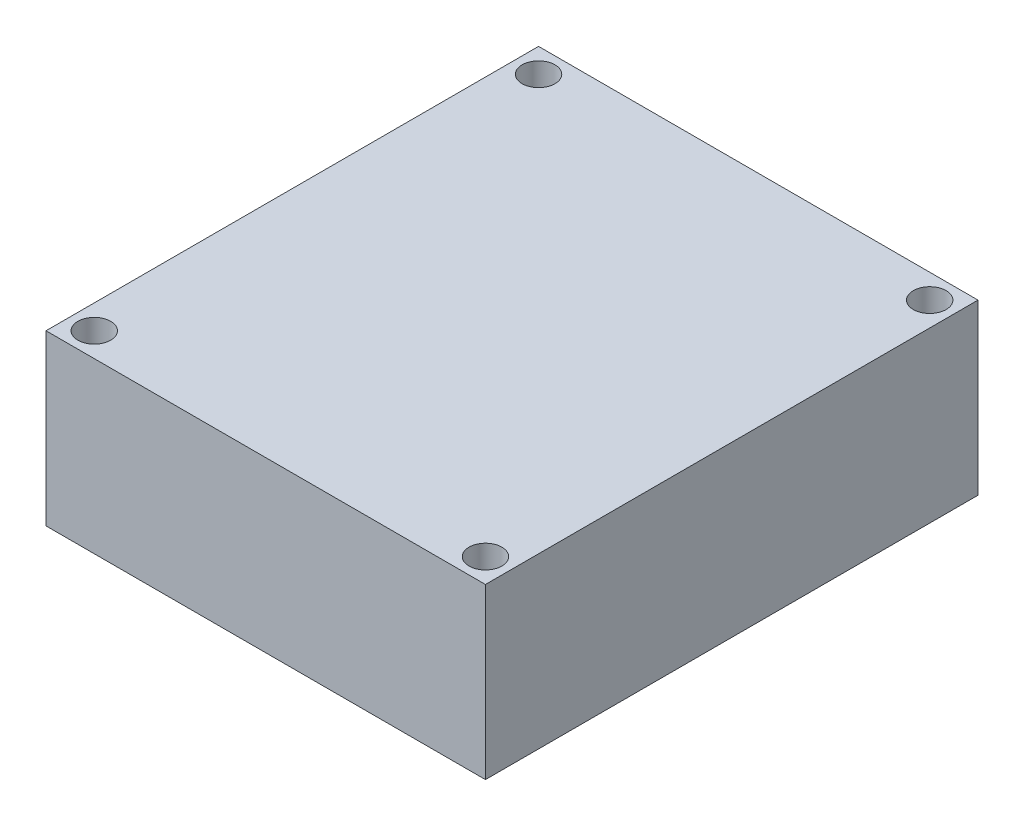
ISO-10303-21;
HEADER;
FILE_DESCRIPTION(('STEP AP214'),'2;1');
FILE_NAME('part.step','',(''),(''),'','','');
FILE_SCHEMA(('AUTOMOTIVE_DESIGN { 1 0 10303 214 1 1 1 1 }'));
ENDSEC;
DATA;
#1=APPLICATION_CONTEXT('core data for automotive mechanical design processes');
#2=APPLICATION_PROTOCOL_DEFINITION('international standard','automotive_design',2000,#1);
#3=PRODUCT_CONTEXT('',#1,'mechanical');
#4=PRODUCT('Part','Part','',(#3));
#5=PRODUCT_RELATED_PRODUCT_CATEGORY('part','',(#4));
#6=PRODUCT_DEFINITION_FORMATION('','',#4);
#7=PRODUCT_DEFINITION_CONTEXT('part definition',#1,'design');
#8=PRODUCT_DEFINITION('design','',#6,#7);
#9=PRODUCT_DEFINITION_SHAPE('','',#8);
#10=(LENGTH_UNIT() NAMED_UNIT(*) SI_UNIT(.MILLI.,.METRE.));
#11=(NAMED_UNIT(*) PLANE_ANGLE_UNIT() SI_UNIT($,.RADIAN.));
#12=(NAMED_UNIT(*) SI_UNIT($,.STERADIAN.) SOLID_ANGLE_UNIT());
#13=UNCERTAINTY_MEASURE_WITH_UNIT(LENGTH_MEASURE(1.E-05),#10,'distance_accuracy_value','');
#14=(GEOMETRIC_REPRESENTATION_CONTEXT(3) GLOBAL_UNCERTAINTY_ASSIGNED_CONTEXT((#13)) GLOBAL_UNIT_ASSIGNED_CONTEXT((#10,
#11,#12)) REPRESENTATION_CONTEXT('',''));
#15=CARTESIAN_POINT('',(0.,0.,0.));
#16=DIRECTION('',(0.,0.,1.));
#17=DIRECTION('',(1.,0.,0.));
#18=AXIS2_PLACEMENT_3D('',#15,#16,#17);
#19=CARTESIAN_POINT('',(-22.75,17.5,25.5));
#20=DIRECTION('',(1.,0.,0.));
#21=DIRECTION('',(0.,0.,-1.));
#22=AXIS2_PLACEMENT_3D('',#19,#20,#21);
#23=PLANE('',#22);
#24=DIRECTION('',(0.,0.,1.));
#25=VECTOR('',#24,1.);
#26=CARTESIAN_POINT('',(-22.75,0.,25.5));
#27=LINE('',#26,#25);
#28=CARTESIAN_POINT('',(-22.75,0.,-25.5));
#29=VERTEX_POINT('',#28);
#30=CARTESIAN_POINT('',(-22.75,0.,25.5));
#31=VERTEX_POINT('',#30);
#32=EDGE_CURVE('E98',#29,#31,#27,.T.);
#33=ORIENTED_EDGE('',*,*,#32,.T.);
#34=DIRECTION('',(0.,-1.,0.));
#35=VECTOR('',#34,1.);
#36=CARTESIAN_POINT('',(-22.75,17.5,25.5));
#37=LINE('',#36,#35);
#38=CARTESIAN_POINT('',(-22.75,17.5,25.5));
#39=VERTEX_POINT('',#38);
#40=EDGE_CURVE('E11',#39,#31,#37,.T.);
#41=ORIENTED_EDGE('',*,*,#40,.F.);
#42=DIRECTION('',(0.,0.,1.));
#43=VECTOR('',#42,1.);
#44=CARTESIAN_POINT('',(-22.75,17.5,25.5));
#45=LINE('',#44,#43);
#46=CARTESIAN_POINT('',(-22.75,17.5,-25.5));
#47=VERTEX_POINT('',#46);
#48=EDGE_CURVE('E86',#47,#39,#45,.T.);
#49=ORIENTED_EDGE('',*,*,#48,.F.);
#50=DIRECTION('',(0.,-1.,0.));
#51=VECTOR('',#50,1.);
#52=CARTESIAN_POINT('',(-22.75,17.5,-25.5));
#53=LINE('',#52,#51);
#54=EDGE_CURVE('E94',#47,#29,#53,.T.);
#55=ORIENTED_EDGE('',*,*,#54,.T.);
#56=EDGE_LOOP('',(#33,#41,#49,#55));
#57=FACE_BOUND('',#56,.T.);
#58=ADVANCED_FACE('F35',(#57),#23,.F.);
#59=CARTESIAN_POINT('',(22.75,17.5,25.5));
#60=DIRECTION('',(0.,0.,-1.));
#61=DIRECTION('',(-1.,0.,0.));
#62=AXIS2_PLACEMENT_3D('',#59,#60,#61);
#63=PLANE('',#62);
#64=DIRECTION('',(1.,0.,0.));
#65=VECTOR('',#64,1.);
#66=CARTESIAN_POINT('',(22.75,0.,25.5));
#67=LINE('',#66,#65);
#68=CARTESIAN_POINT('',(22.75,0.,25.5));
#69=VERTEX_POINT('',#68);
#70=EDGE_CURVE('E90',#31,#69,#67,.T.);
#71=ORIENTED_EDGE('',*,*,#70,.T.);
#72=DIRECTION('',(0.,-1.,0.));
#73=VECTOR('',#72,1.);
#74=CARTESIAN_POINT('',(22.75,17.5,25.5));
#75=LINE('',#74,#73);
#76=CARTESIAN_POINT('',(22.75,17.5,25.5));
#77=VERTEX_POINT('',#76);
#78=EDGE_CURVE('E43',#77,#69,#75,.T.);
#79=ORIENTED_EDGE('',*,*,#78,.F.);
#80=DIRECTION('',(1.,0.,0.));
#81=VECTOR('',#80,1.);
#82=CARTESIAN_POINT('',(22.75,17.5,25.5));
#83=LINE('',#82,#81);
#84=EDGE_CURVE('E81',#39,#77,#83,.T.);
#85=ORIENTED_EDGE('',*,*,#84,.F.);
#86=ORIENTED_EDGE('',*,*,#40,.T.);
#87=EDGE_LOOP('',(#71,#79,#85,#86));
#88=FACE_BOUND('',#87,.T.);
#89=ADVANCED_FACE('F89',(#88),#63,.F.);
#90=CARTESIAN_POINT('',(22.75,17.5,25.5));
#91=DIRECTION('',(-1.,0.,0.));
#92=DIRECTION('',(0.,0.,1.));
#93=AXIS2_PLACEMENT_3D('',#90,#91,#92);
#94=PLANE('',#93);
#95=DIRECTION('',(0.,0.,-1.));
#96=VECTOR('',#95,1.);
#97=CARTESIAN_POINT('',(22.75,0.,25.5));
#98=LINE('',#97,#96);
#99=CARTESIAN_POINT('',(22.75,0.,-25.5));
#100=VERTEX_POINT('',#99);
#101=EDGE_CURVE('E68',#69,#100,#98,.T.);
#102=ORIENTED_EDGE('',*,*,#101,.T.);
#103=DIRECTION('',(0.,-1.,0.));
#104=VECTOR('',#103,1.);
#105=CARTESIAN_POINT('',(22.75,17.5,-25.5));
#106=LINE('',#105,#104);
#107=CARTESIAN_POINT('',(22.75,17.5,-25.5));
#108=VERTEX_POINT('',#107);
#109=EDGE_CURVE('E91',#108,#100,#106,.T.);
#110=ORIENTED_EDGE('',*,*,#109,.F.);
#111=DIRECTION('',(0.,0.,-1.));
#112=VECTOR('',#111,1.);
#113=CARTESIAN_POINT('',(22.75,17.5,25.5));
#114=LINE('',#113,#112);
#115=EDGE_CURVE('E84',#77,#108,#114,.T.);
#116=ORIENTED_EDGE('',*,*,#115,.F.);
#117=ORIENTED_EDGE('',*,*,#78,.T.);
#118=EDGE_LOOP('',(#102,#110,#116,#117));
#119=FACE_BOUND('',#118,.T.);
#120=ADVANCED_FACE('F92',(#119),#94,.F.);
#121=CARTESIAN_POINT('',(22.75,17.5,-25.5));
#122=DIRECTION('',(0.,0.,1.));
#123=DIRECTION('',(1.,0.,0.));
#124=AXIS2_PLACEMENT_3D('',#121,#122,#123);
#125=PLANE('',#124);
#126=DIRECTION('',(-1.,0.,0.));
#127=VECTOR('',#126,1.);
#128=CARTESIAN_POINT('',(22.75,0.,-25.5));
#129=LINE('',#128,#127);
#130=EDGE_CURVE('E74',#100,#29,#129,.T.);
#131=ORIENTED_EDGE('',*,*,#130,.T.);
#132=ORIENTED_EDGE('',*,*,#54,.F.);
#133=DIRECTION('',(-1.,0.,0.));
#134=VECTOR('',#133,1.);
#135=CARTESIAN_POINT('',(22.75,17.5,-25.5));
#136=LINE('',#135,#134);
#137=EDGE_CURVE('E51',#108,#47,#136,.T.);
#138=ORIENTED_EDGE('',*,*,#137,.F.);
#139=ORIENTED_EDGE('',*,*,#109,.T.);
#140=EDGE_LOOP('',(#131,#132,#138,#139));
#141=FACE_BOUND('',#140,.T.);
#142=ADVANCED_FACE('F106',(#141),#125,.F.);
#143=CARTESIAN_POINT('',(0.,17.5,0.));
#144=DIRECTION('',(0.,1.,0.));
#145=DIRECTION('',(0.,0.,1.));
#146=AXIS2_PLACEMENT_3D('',#143,#144,#145);
#147=PLANE('',#146);
#148=CARTESIAN_POINT('',(-20.25,17.5,23.));
#149=DIRECTION('',(0.,1.,0.));
#150=DIRECTION('',(0.,0.,-1.));
#151=AXIS2_PLACEMENT_3D('',#148,#149,#150);
#152=CIRCLE('',#151,1.7);
#153=CARTESIAN_POINT('',(-20.25,17.5,21.3));
#154=VERTEX_POINT('',#153);
#155=EDGE_CURVE('E125',#154,#154,#152,.T.);
#156=ORIENTED_EDGE('',*,*,#155,.F.);
#157=EDGE_LOOP('',(#156));
#158=FACE_BOUND('',#157,.T.);
#159=CARTESIAN_POINT('',(20.25,17.5,-23.));
#160=DIRECTION('',(0.,1.,0.));
#161=DIRECTION('',(0.,0.,-1.));
#162=AXIS2_PLACEMENT_3D('',#159,#160,#161);
#163=CIRCLE('',#162,1.7);
#164=CARTESIAN_POINT('',(20.25,17.5,-24.7));
#165=VERTEX_POINT('',#164);
#166=EDGE_CURVE('E118',#165,#165,#163,.T.);
#167=ORIENTED_EDGE('',*,*,#166,.F.);
#168=EDGE_LOOP('',(#167));
#169=FACE_BOUND('',#168,.T.);
#170=CARTESIAN_POINT('',(-20.25,17.5,-23.));
#171=DIRECTION('',(0.,1.,0.));
#172=DIRECTION('',(0.,0.,1.));
#173=AXIS2_PLACEMENT_3D('',#170,#171,#172);
#174=CIRCLE('',#173,1.7);
#175=CARTESIAN_POINT('',(-20.25,17.5,-21.3));
#176=VERTEX_POINT('',#175);
#177=EDGE_CURVE('E130',#176,#176,#174,.T.);
#178=ORIENTED_EDGE('',*,*,#177,.F.);
#179=EDGE_LOOP('',(#178));
#180=FACE_BOUND('',#179,.T.);
#181=CARTESIAN_POINT('',(20.25,17.5,23.));
#182=DIRECTION('',(0.,1.,0.));
#183=DIRECTION('',(0.,0.,1.));
#184=AXIS2_PLACEMENT_3D('',#181,#182,#183);
#185=CIRCLE('',#184,1.7);
#186=CARTESIAN_POINT('',(20.25,17.5,24.7));
#187=VERTEX_POINT('',#186);
#188=EDGE_CURVE('E112',#187,#187,#185,.T.);
#189=ORIENTED_EDGE('',*,*,#188,.F.);
#190=EDGE_LOOP('',(#189));
#191=FACE_BOUND('',#190,.T.);
#192=ORIENTED_EDGE('',*,*,#48,.T.);
#193=ORIENTED_EDGE('',*,*,#84,.T.);
#194=ORIENTED_EDGE('',*,*,#115,.T.);
#195=ORIENTED_EDGE('',*,*,#137,.T.);
#196=EDGE_LOOP('',(#192,#193,#194,#195));
#197=FACE_BOUND('',#196,.T.);
#198=ADVANCED_FACE('F82',(#158,#169,#180,#191,#197),#147,.T.);
#199=CARTESIAN_POINT('',(0.,0.,0.));
#200=DIRECTION('',(0.,1.,0.));
#201=DIRECTION('',(0.,0.,1.));
#202=AXIS2_PLACEMENT_3D('',#199,#200,#201);
#203=PLANE('',#202);
#204=CARTESIAN_POINT('',(-20.25,0.,23.));
#205=DIRECTION('',(0.,1.,0.));
#206=DIRECTION('',(0.,0.,-1.));
#207=AXIS2_PLACEMENT_3D('',#204,#205,#206);
#208=CIRCLE('',#207,1.7);
#209=CARTESIAN_POINT('',(-20.25,0.,21.3));
#210=VERTEX_POINT('',#209);
#211=EDGE_CURVE('E115',#210,#210,#208,.T.);
#212=ORIENTED_EDGE('',*,*,#211,.T.);
#213=EDGE_LOOP('',(#212));
#214=FACE_BOUND('',#213,.T.);
#215=CARTESIAN_POINT('',(20.25,0.,-23.));
#216=DIRECTION('',(0.,1.,0.));
#217=DIRECTION('',(0.,0.,-1.));
#218=AXIS2_PLACEMENT_3D('',#215,#216,#217);
#219=CIRCLE('',#218,1.7);
#220=CARTESIAN_POINT('',(20.25,0.,-24.7));
#221=VERTEX_POINT('',#220);
#222=EDGE_CURVE('E121',#221,#221,#219,.T.);
#223=ORIENTED_EDGE('',*,*,#222,.T.);
#224=EDGE_LOOP('',(#223));
#225=FACE_BOUND('',#224,.T.);
#226=CARTESIAN_POINT('',(-20.25,0.,-23.));
#227=DIRECTION('',(0.,1.,0.));
#228=DIRECTION('',(0.,0.,1.));
#229=AXIS2_PLACEMENT_3D('',#226,#227,#228);
#230=CIRCLE('',#229,1.7);
#231=CARTESIAN_POINT('',(-20.25,0.,-21.3));
#232=VERTEX_POINT('',#231);
#233=EDGE_CURVE('E122',#232,#232,#230,.T.);
#234=ORIENTED_EDGE('',*,*,#233,.T.);
#235=EDGE_LOOP('',(#234));
#236=FACE_BOUND('',#235,.T.);
#237=CARTESIAN_POINT('',(20.25,0.,23.));
#238=DIRECTION('',(0.,1.,0.));
#239=DIRECTION('',(0.,0.,1.));
#240=AXIS2_PLACEMENT_3D('',#237,#238,#239);
#241=CIRCLE('',#240,1.7);
#242=CARTESIAN_POINT('',(20.25,0.,24.7));
#243=VERTEX_POINT('',#242);
#244=EDGE_CURVE('E101',#243,#243,#241,.T.);
#245=ORIENTED_EDGE('',*,*,#244,.T.);
#246=EDGE_LOOP('',(#245));
#247=FACE_BOUND('',#246,.T.);
#248=ORIENTED_EDGE('',*,*,#32,.F.);
#249=ORIENTED_EDGE('',*,*,#130,.F.);
#250=ORIENTED_EDGE('',*,*,#101,.F.);
#251=ORIENTED_EDGE('',*,*,#70,.F.);
#252=EDGE_LOOP('',(#248,#249,#250,#251));
#253=FACE_BOUND('',#252,.T.);
#254=ADVANCED_FACE('F109',(#214,#225,#236,#247,#253),#203,.F.);
#255=CARTESIAN_POINT('',(20.25,0.,23.));
#256=DIRECTION('',(0.,1.,0.));
#257=DIRECTION('',(0.,0.,1.));
#258=AXIS2_PLACEMENT_3D('',#255,#256,#257);
#259=CYLINDRICAL_SURFACE('',#258,1.7);
#260=ORIENTED_EDGE('',*,*,#244,.F.);
#261=EDGE_LOOP('',(#260));
#262=FACE_BOUND('',#261,.T.);
#263=ORIENTED_EDGE('',*,*,#188,.T.);
#264=EDGE_LOOP('',(#263));
#265=FACE_BOUND('',#264,.T.);
#266=ADVANCED_FACE('F142',(#262,#265),#259,.F.);
#267=CARTESIAN_POINT('',(-20.25,0.,-23.));
#268=DIRECTION('',(0.,1.,0.));
#269=DIRECTION('',(0.,0.,1.));
#270=AXIS2_PLACEMENT_3D('',#267,#268,#269);
#271=CYLINDRICAL_SURFACE('',#270,1.7);
#272=ORIENTED_EDGE('',*,*,#233,.F.);
#273=EDGE_LOOP('',(#272));
#274=FACE_BOUND('',#273,.T.);
#275=ORIENTED_EDGE('',*,*,#177,.T.);
#276=EDGE_LOOP('',(#275));
#277=FACE_BOUND('',#276,.T.);
#278=ADVANCED_FACE('F138',(#274,#277),#271,.F.);
#279=CARTESIAN_POINT('',(20.25,0.,-23.));
#280=DIRECTION('',(0.,1.,0.));
#281=DIRECTION('',(0.,0.,1.));
#282=AXIS2_PLACEMENT_3D('',#279,#280,#281);
#283=CYLINDRICAL_SURFACE('',#282,1.7);
#284=ORIENTED_EDGE('',*,*,#222,.F.);
#285=EDGE_LOOP('',(#284));
#286=FACE_BOUND('',#285,.T.);
#287=ORIENTED_EDGE('',*,*,#166,.T.);
#288=EDGE_LOOP('',(#287));
#289=FACE_BOUND('',#288,.T.);
#290=ADVANCED_FACE('F141',(#286,#289),#283,.F.);
#291=CARTESIAN_POINT('',(-20.25,0.,23.));
#292=DIRECTION('',(0.,1.,0.));
#293=DIRECTION('',(0.,0.,1.));
#294=AXIS2_PLACEMENT_3D('',#291,#292,#293);
#295=CYLINDRICAL_SURFACE('',#294,1.7);
#296=ORIENTED_EDGE('',*,*,#211,.F.);
#297=EDGE_LOOP('',(#296));
#298=FACE_BOUND('',#297,.T.);
#299=ORIENTED_EDGE('',*,*,#155,.T.);
#300=EDGE_LOOP('',(#299));
#301=FACE_BOUND('',#300,.T.);
#302=ADVANCED_FACE('F203',(#298,#301),#295,.F.);
#303=CLOSED_SHELL('',(#58,#89,#120,#142,#198,#254,#266,#278,#290,#302));
#304=MANIFOLD_SOLID_BREP('B2',#303);
#305=ADVANCED_BREP_SHAPE_REPRESENTATION('',(#18,#304),#14);
#306=SHAPE_DEFINITION_REPRESENTATION(#9,#305);
ENDSEC;
END-ISO-10303-21;
